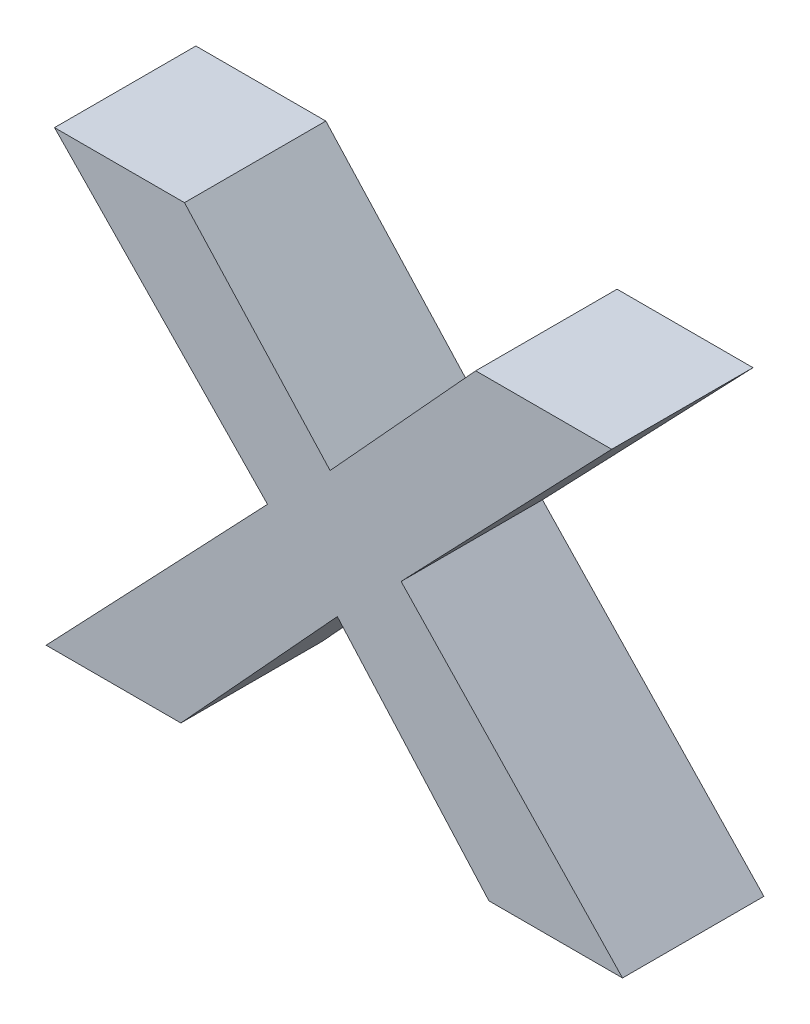
ISO-10303-21;
HEADER;
FILE_DESCRIPTION(('STEP AP214'),'2;1');
FILE_NAME('part.step','',(''),(''),'','','');
FILE_SCHEMA(('AUTOMOTIVE_DESIGN { 1 0 10303 214 1 1 1 1 }'));
ENDSEC;
DATA;
#1=APPLICATION_CONTEXT('core data for automotive mechanical design processes');
#2=APPLICATION_PROTOCOL_DEFINITION('international standard','automotive_design',2000,#1);
#3=PRODUCT_CONTEXT('',#1,'mechanical');
#4=PRODUCT('Part','Part','',(#3));
#5=PRODUCT_RELATED_PRODUCT_CATEGORY('part','',(#4));
#6=PRODUCT_DEFINITION_FORMATION('','',#4);
#7=PRODUCT_DEFINITION_CONTEXT('part definition',#1,'design');
#8=PRODUCT_DEFINITION('design','',#6,#7);
#9=PRODUCT_DEFINITION_SHAPE('','',#8);
#10=(LENGTH_UNIT() NAMED_UNIT(*) SI_UNIT(.MILLI.,.METRE.));
#11=(NAMED_UNIT(*) PLANE_ANGLE_UNIT() SI_UNIT($,.RADIAN.));
#12=(NAMED_UNIT(*) SI_UNIT($,.STERADIAN.) SOLID_ANGLE_UNIT());
#13=UNCERTAINTY_MEASURE_WITH_UNIT(LENGTH_MEASURE(1.E-05),#10,'distance_accuracy_value','');
#14=(GEOMETRIC_REPRESENTATION_CONTEXT(3) GLOBAL_UNCERTAINTY_ASSIGNED_CONTEXT((#13)) GLOBAL_UNIT_ASSIGNED_CONTEXT((#10,
#11,#12)) REPRESENTATION_CONTEXT('',''));
#15=CARTESIAN_POINT('',(0.,0.,0.));
#16=DIRECTION('',(0.,0.,1.));
#17=DIRECTION('',(1.,0.,0.));
#18=AXIS2_PLACEMENT_3D('',#15,#16,#17);
#19=CARTESIAN_POINT('',(-15.490338898199,-1.151083018456,-5.5));
#20=DIRECTION('',(0.,0.,1.));
#21=DIRECTION('',(0.,-1.,0.));
#22=AXIS2_PLACEMENT_3D('',#19,#20,#21);
#23=PLANE('',#22);
#24=DIRECTION('',(1.,0.,0.));
#25=VECTOR('',#24,1.);
#26=CARTESIAN_POINT('',(-17.525028602523,-2.747234350301,-5.5));
#27=LINE('',#26,#25);
#28=CARTESIAN_POINT('',(-17.525028602523,-2.747234350301,-5.5));
#29=VERTEX_POINT('',#28);
#30=CARTESIAN_POINT('',(-16.571944402523,-2.747234350301,-5.5));
#31=VERTEX_POINT('',#30);
#32=EDGE_CURVE('E187',#29,#31,#27,.T.);
#33=ORIENTED_EDGE('',*,*,#32,.T.);
#34=DIRECTION('',(0.676294852111834,0.736631029082425,0.));
#35=VECTOR('',#34,1.);
#36=CARTESIAN_POINT('',(-16.571944402523,-2.747234350301,-5.5));
#37=LINE('',#36,#35);
#38=CARTESIAN_POINT('',(-15.464955958079,-1.541485061412,-5.5));
#39=VERTEX_POINT('',#38);
#40=EDGE_CURVE('E175',#31,#39,#37,.T.);
#41=ORIENTED_EDGE('',*,*,#40,.T.);
#42=DIRECTION('',(0.664621174096527,-0.747180496896536,0.));
#43=VECTOR('',#42,1.);
#44=CARTESIAN_POINT('',(-15.464955958079,-1.541485061412,-5.5));
#45=LINE('',#44,#43);
#46=CARTESIAN_POINT('',(-14.392435313635,-2.747234350301,-5.5));
#47=VERTEX_POINT('',#46);
#48=EDGE_CURVE('E170',#39,#47,#45,.T.);
#49=ORIENTED_EDGE('',*,*,#48,.T.);
#50=DIRECTION('',(1.,0.,0.));
#51=VECTOR('',#50,1.);
#52=CARTESIAN_POINT('',(-14.392435313635,-2.747234350301,-5.5));
#53=LINE('',#52,#51);
#54=CARTESIAN_POINT('',(-13.447439602523,-2.747234350301,-5.5));
#55=VERTEX_POINT('',#54);
#56=EDGE_CURVE('E200',#47,#55,#53,.T.);
#57=ORIENTED_EDGE('',*,*,#56,.T.);
#58=DIRECTION('',(-0.689286496759423,0.724488871815932,0.));
#59=VECTOR('',#58,1.);
#60=CARTESIAN_POINT('',(-13.447439602523,-2.747234350301,-5.5));
#61=LINE('',#60,#59);
#62=CARTESIAN_POINT('',(-15.013868891412,-1.100806350301,-5.5));
#63=VERTEX_POINT('',#62);
#64=EDGE_CURVE('E148',#55,#63,#61,.T.);
#65=ORIENTED_EDGE('',*,*,#64,.T.);
#66=DIRECTION('',(0.691909548427936,0.721984194282845,0.));
#67=VECTOR('',#66,1.);
#68=CARTESIAN_POINT('',(-15.013868891412,-1.100806350301,-5.5));
#69=LINE('',#68,#67);
#70=CARTESIAN_POINT('',(-13.524198402523,0.453614383032,-5.5));
#71=VERTEX_POINT('',#70);
#72=EDGE_CURVE('E145',#63,#71,#69,.T.);
#73=ORIENTED_EDGE('',*,*,#72,.T.);
#74=DIRECTION('',(-1.,0.,0.));
#75=VECTOR('',#74,1.);
#76=CARTESIAN_POINT('',(-13.524198402523,0.453614383032,-5.5));
#77=LINE('',#76,#75);
#78=CARTESIAN_POINT('',(-14.486025846968,0.453614383032,-5.5));
#79=VERTEX_POINT('',#78);
#80=EDGE_CURVE('E131',#71,#79,#77,.T.);
#81=ORIENTED_EDGE('',*,*,#80,.T.);
#82=DIRECTION('',(-0.674961158054118,-0.737853261237113,0.));
#83=VECTOR('',#82,1.);
#84=CARTESIAN_POINT('',(-14.486025846968,0.453614383032,-5.5));
#85=LINE('',#84,#83);
#86=CARTESIAN_POINT('',(-15.516128491412,-0.67247203919,-5.5));
#87=VERTEX_POINT('',#86);
#88=EDGE_CURVE('E226',#79,#87,#85,.T.);
#89=ORIENTED_EDGE('',*,*,#88,.T.);
#90=DIRECTION('',(-0.674958137732798,0.737856024105159,0.));
#91=VECTOR('',#90,1.);
#92=CARTESIAN_POINT('',(-15.516128491412,-0.67247203919,-5.5));
#93=LINE('',#92,#91);
#94=CARTESIAN_POINT('',(-16.54622266919,0.453614383032,-5.5));
#95=VERTEX_POINT('',#94);
#96=EDGE_CURVE('E213',#87,#95,#93,.T.);
#97=ORIENTED_EDGE('',*,*,#96,.T.);
#98=DIRECTION('',(-1.,0.,0.));
#99=VECTOR('',#98,1.);
#100=CARTESIAN_POINT('',(-16.54622266919,0.453614383032,-5.5));
#101=LINE('',#100,#99);
#102=CARTESIAN_POINT('',(-17.465643402523,0.453614383032,-5.5));
#103=VERTEX_POINT('',#102);
#104=EDGE_CURVE('E216',#95,#103,#101,.T.);
#105=ORIENTED_EDGE('',*,*,#104,.T.);
#106=DIRECTION('',(0.696017007431194,-0.718025295770647,0.));
#107=VECTOR('',#106,1.);
#108=CARTESIAN_POINT('',(-17.465643402523,0.453614383032,-5.5));
#109=LINE('',#108,#107);
#110=CARTESIAN_POINT('',(-15.958867424746,-1.100806350301,-5.5));
#111=VERTEX_POINT('',#110);
#112=EDGE_CURVE('E196',#103,#111,#109,.T.);
#113=ORIENTED_EDGE('',*,*,#112,.T.);
#114=DIRECTION('',(-0.689224564032195,-0.724547790235145,0.));
#115=VECTOR('',#114,1.);
#116=CARTESIAN_POINT('',(-15.958867424746,-1.100806350301,-5.5));
#117=LINE('',#116,#115);
#118=EDGE_CURVE('E11',#111,#29,#117,.T.);
#119=ORIENTED_EDGE('',*,*,#118,.T.);
#120=EDGE_LOOP('',(#33,#41,#49,#57,#65,#73,#81,#89,#97,#105,#113,#119));
#121=FACE_BOUND('',#120,.T.);
#122=ADVANCED_FACE('F16',(#121),#23,.T.);
#123=CARTESIAN_POINT('',(-15.490338898199,-1.151083018456,-6.5));
#124=DIRECTION('',(0.,0.,1.));
#125=DIRECTION('',(0.,-1.,0.));
#126=AXIS2_PLACEMENT_3D('',#123,#124,#125);
#127=PLANE('',#126);
#128=DIRECTION('',(1.,0.,0.));
#129=VECTOR('',#128,1.);
#130=CARTESIAN_POINT('',(-17.525028602523,-2.747234350301,-6.5));
#131=LINE('',#130,#129);
#132=CARTESIAN_POINT('',(-17.525028602523,-2.747234350301,-6.5));
#133=VERTEX_POINT('',#132);
#134=CARTESIAN_POINT('',(-16.571944402523,-2.747234350301,-6.5));
#135=VERTEX_POINT('',#134);
#136=EDGE_CURVE('E245',#133,#135,#131,.T.);
#137=ORIENTED_EDGE('',*,*,#136,.F.);
#138=DIRECTION('',(-0.689224564032195,-0.724547790235145,0.));
#139=VECTOR('',#138,1.);
#140=CARTESIAN_POINT('',(-15.958867424746,-1.100806350301,-6.5));
#141=LINE('',#140,#139);
#142=CARTESIAN_POINT('',(-15.958867424746,-1.100806350301,-6.5));
#143=VERTEX_POINT('',#142);
#144=EDGE_CURVE('E27',#143,#133,#141,.T.);
#145=ORIENTED_EDGE('',*,*,#144,.F.);
#146=DIRECTION('',(0.696017007431194,-0.718025295770647,0.));
#147=VECTOR('',#146,1.);
#148=CARTESIAN_POINT('',(-17.465643402523,0.453614383032,-6.5));
#149=LINE('',#148,#147);
#150=CARTESIAN_POINT('',(-17.465643402523,0.453614383032,-6.5));
#151=VERTEX_POINT('',#150);
#152=EDGE_CURVE('E220',#151,#143,#149,.T.);
#153=ORIENTED_EDGE('',*,*,#152,.F.);
#154=DIRECTION('',(-1.,0.,0.));
#155=VECTOR('',#154,1.);
#156=CARTESIAN_POINT('',(-16.54622266919,0.453614383032,-6.5));
#157=LINE('',#156,#155);
#158=CARTESIAN_POINT('',(-16.54622266919,0.453614383032,-6.5));
#159=VERTEX_POINT('',#158);
#160=EDGE_CURVE('E208',#159,#151,#157,.T.);
#161=ORIENTED_EDGE('',*,*,#160,.F.);
#162=DIRECTION('',(-0.674958137732798,0.737856024105159,0.));
#163=VECTOR('',#162,1.);
#164=CARTESIAN_POINT('',(-15.516128491412,-0.67247203919,-6.5));
#165=LINE('',#164,#163);
#166=CARTESIAN_POINT('',(-15.516128491412,-0.67247203919,-6.5));
#167=VERTEX_POINT('',#166);
#168=EDGE_CURVE('E221',#167,#159,#165,.T.);
#169=ORIENTED_EDGE('',*,*,#168,.F.);
#170=DIRECTION('',(-0.674961158054118,-0.737853261237113,0.));
#171=VECTOR('',#170,1.);
#172=CARTESIAN_POINT('',(-14.486025846968,0.453614383032,-6.5));
#173=LINE('',#172,#171);
#174=CARTESIAN_POINT('',(-14.486025846968,0.453614383032,-6.5));
#175=VERTEX_POINT('',#174);
#176=EDGE_CURVE('E142',#175,#167,#173,.T.);
#177=ORIENTED_EDGE('',*,*,#176,.F.);
#178=DIRECTION('',(-1.,0.,0.));
#179=VECTOR('',#178,1.);
#180=CARTESIAN_POINT('',(-13.524198402523,0.453614383032,-6.5));
#181=LINE('',#180,#179);
#182=CARTESIAN_POINT('',(-13.524198402523,0.453614383032,-6.5));
#183=VERTEX_POINT('',#182);
#184=EDGE_CURVE('E153',#183,#175,#181,.T.);
#185=ORIENTED_EDGE('',*,*,#184,.F.);
#186=DIRECTION('',(0.691909548427936,0.721984194282845,0.));
#187=VECTOR('',#186,1.);
#188=CARTESIAN_POINT('',(-15.013868891412,-1.100806350301,-6.5));
#189=LINE('',#188,#187);
#190=CARTESIAN_POINT('',(-15.013868891412,-1.100806350301,-6.5));
#191=VERTEX_POINT('',#190);
#192=EDGE_CURVE('E156',#191,#183,#189,.T.);
#193=ORIENTED_EDGE('',*,*,#192,.F.);
#194=DIRECTION('',(-0.689286496759423,0.724488871815932,0.));
#195=VECTOR('',#194,1.);
#196=CARTESIAN_POINT('',(-13.447439602523,-2.747234350301,-6.5));
#197=LINE('',#196,#195);
#198=CARTESIAN_POINT('',(-13.447439602523,-2.747234350301,-6.5));
#199=VERTEX_POINT('',#198);
#200=EDGE_CURVE('E203',#199,#191,#197,.T.);
#201=ORIENTED_EDGE('',*,*,#200,.F.);
#202=DIRECTION('',(1.,0.,0.));
#203=VECTOR('',#202,1.);
#204=CARTESIAN_POINT('',(-14.392435313635,-2.747234350301,-6.5));
#205=LINE('',#204,#203);
#206=CARTESIAN_POINT('',(-14.392435313635,-2.747234350301,-6.5));
#207=VERTEX_POINT('',#206);
#208=EDGE_CURVE('E166',#207,#199,#205,.T.);
#209=ORIENTED_EDGE('',*,*,#208,.F.);
#210=DIRECTION('',(0.664621174096527,-0.747180496896536,0.));
#211=VECTOR('',#210,1.);
#212=CARTESIAN_POINT('',(-15.464955958079,-1.541485061412,-6.5));
#213=LINE('',#212,#211);
#214=CARTESIAN_POINT('',(-15.464955958079,-1.541485061412,-6.5));
#215=VERTEX_POINT('',#214);
#216=EDGE_CURVE('E171',#215,#207,#213,.T.);
#217=ORIENTED_EDGE('',*,*,#216,.F.);
#218=DIRECTION('',(0.676294852111834,0.736631029082425,0.));
#219=VECTOR('',#218,1.);
#220=CARTESIAN_POINT('',(-16.571944402523,-2.747234350301,-6.5));
#221=LINE('',#220,#219);
#222=EDGE_CURVE('E176',#135,#215,#221,.T.);
#223=ORIENTED_EDGE('',*,*,#222,.F.);
#224=EDGE_LOOP('',(#137,#145,#153,#161,#169,#177,#185,#193,#201,#209,#217,#223));
#225=FACE_BOUND('',#224,.T.);
#226=ADVANCED_FACE('F276',(#225),#127,.F.);
#227=CARTESIAN_POINT('',(-16.7419480136345,-1.924020350301,-5.49));
#228=DIRECTION('',(0.724547790235145,-0.689224564032195,0.));
#229=DIRECTION('',(0.689224564032195,0.724547790235145,0.));
#230=AXIS2_PLACEMENT_3D('',#227,#228,#229);
#231=PLANE('',#230);
#232=DIRECTION('',(0.,0.,1.));
#233=VECTOR('',#232,1.);
#234=CARTESIAN_POINT('',(-15.958867424746,-1.100806350301,-6.5));
#235=LINE('',#234,#233);
#236=EDGE_CURVE('E198',#143,#111,#235,.T.);
#237=ORIENTED_EDGE('',*,*,#236,.F.);
#238=ORIENTED_EDGE('',*,*,#144,.T.);
#239=DIRECTION('',(0.,0.,1.));
#240=VECTOR('',#239,1.);
#241=CARTESIAN_POINT('',(-17.525028602523,-2.747234350301,-6.5));
#242=LINE('',#241,#240);
#243=EDGE_CURVE('E242',#133,#29,#242,.T.);
#244=ORIENTED_EDGE('',*,*,#243,.T.);
#245=ORIENTED_EDGE('',*,*,#118,.F.);
#246=EDGE_LOOP('',(#237,#238,#244,#245));
#247=FACE_BOUND('',#246,.T.);
#248=ADVANCED_FACE('F284',(#247),#231,.F.);
#249=CARTESIAN_POINT('',(-16.7122554136345,-0.3235959836345,-5.49));
#250=DIRECTION('',(0.718025295770647,0.696017007431194,0.));
#251=DIRECTION('',(0.,0.,-1.));
#252=AXIS2_PLACEMENT_3D('',#249,#250,#251);
#253=PLANE('',#252);
#254=DIRECTION('',(0.,0.,1.));
#255=VECTOR('',#254,1.);
#256=CARTESIAN_POINT('',(-17.465643402523,0.453614383032,-6.5));
#257=LINE('',#256,#255);
#258=EDGE_CURVE('E212',#151,#103,#257,.T.);
#259=ORIENTED_EDGE('',*,*,#258,.F.);
#260=ORIENTED_EDGE('',*,*,#152,.T.);
#261=ORIENTED_EDGE('',*,*,#236,.T.);
#262=ORIENTED_EDGE('',*,*,#112,.F.);
#263=EDGE_LOOP('',(#259,#260,#261,#262));
#264=FACE_BOUND('',#263,.T.);
#265=ADVANCED_FACE('F279',(#264),#253,.F.);
#266=CARTESIAN_POINT('',(-17.0059330358565,0.453614383032,-5.49));
#267=DIRECTION('',(0.,-1.,0.));
#268=DIRECTION('',(0.,0.,1.));
#269=AXIS2_PLACEMENT_3D('',#266,#267,#268);
#270=PLANE('',#269);
#271=DIRECTION('',(0.,0.,1.));
#272=VECTOR('',#271,1.);
#273=CARTESIAN_POINT('',(-16.54622266919,0.453614383032,-6.5));
#274=LINE('',#273,#272);
#275=EDGE_CURVE('E225',#159,#95,#274,.T.);
#276=ORIENTED_EDGE('',*,*,#275,.F.);
#277=ORIENTED_EDGE('',*,*,#160,.T.);
#278=ORIENTED_EDGE('',*,*,#258,.T.);
#279=ORIENTED_EDGE('',*,*,#104,.F.);
#280=EDGE_LOOP('',(#276,#277,#278,#279));
#281=FACE_BOUND('',#280,.T.);
#282=ADVANCED_FACE('F268',(#281),#270,.F.);
#283=CARTESIAN_POINT('',(-16.031175580301,-0.109428828079,-5.49));
#284=DIRECTION('',(-0.73785602410516,-0.674958137732797,0.));
#285=DIRECTION('',(0.,0.,1.));
#286=AXIS2_PLACEMENT_3D('',#283,#284,#285);
#287=PLANE('',#286);
#288=DIRECTION('',(0.,0.,1.));
#289=VECTOR('',#288,1.);
#290=CARTESIAN_POINT('',(-15.516128491412,-0.67247203919,-6.5));
#291=LINE('',#290,#289);
#292=EDGE_CURVE('E238',#167,#87,#291,.T.);
#293=ORIENTED_EDGE('',*,*,#292,.F.);
#294=ORIENTED_EDGE('',*,*,#168,.T.);
#295=ORIENTED_EDGE('',*,*,#275,.T.);
#296=ORIENTED_EDGE('',*,*,#96,.F.);
#297=EDGE_LOOP('',(#293,#294,#295,#296));
#298=FACE_BOUND('',#297,.T.);
#299=ADVANCED_FACE('F266',(#298),#287,.F.);
#300=CARTESIAN_POINT('',(-15.00107716919,-0.109428828079,-5.49));
#301=DIRECTION('',(0.737853261237113,-0.674961158054118,0.));
#302=DIRECTION('',(0.674961158054118,0.737853261237113,0.));
#303=AXIS2_PLACEMENT_3D('',#300,#301,#302);
#304=PLANE('',#303);
#305=DIRECTION('',(0.,0.,1.));
#306=VECTOR('',#305,1.);
#307=CARTESIAN_POINT('',(-14.486025846968,0.453614383032,-6.5));
#308=LINE('',#307,#306);
#309=EDGE_CURVE('E20',#175,#79,#308,.T.);
#310=ORIENTED_EDGE('',*,*,#309,.F.);
#311=ORIENTED_EDGE('',*,*,#176,.T.);
#312=ORIENTED_EDGE('',*,*,#292,.T.);
#313=ORIENTED_EDGE('',*,*,#88,.F.);
#314=EDGE_LOOP('',(#310,#311,#312,#313));
#315=FACE_BOUND('',#314,.T.);
#316=ADVANCED_FACE('F273',(#315),#304,.F.);
#317=CARTESIAN_POINT('',(-14.0051121247455,0.453614383032,-5.49));
#318=DIRECTION('',(0.,-1.,0.));
#319=DIRECTION('',(0.,0.,1.));
#320=AXIS2_PLACEMENT_3D('',#317,#318,#319);
#321=PLANE('',#320);
#322=DIRECTION('',(0.,0.,1.));
#323=VECTOR('',#322,1.);
#324=CARTESIAN_POINT('',(-13.524198402523,0.453614383032,-6.5));
#325=LINE('',#324,#323);
#326=EDGE_CURVE('E136',#183,#71,#325,.T.);
#327=ORIENTED_EDGE('',*,*,#326,.F.);
#328=ORIENTED_EDGE('',*,*,#184,.T.);
#329=ORIENTED_EDGE('',*,*,#309,.T.);
#330=ORIENTED_EDGE('',*,*,#80,.F.);
#331=EDGE_LOOP('',(#327,#328,#329,#330));
#332=FACE_BOUND('',#331,.T.);
#333=ADVANCED_FACE('F133',(#332),#321,.F.);
#334=CARTESIAN_POINT('',(-14.2690336469675,-0.3235959836345,-5.49));
#335=DIRECTION('',(-0.721984194282846,0.691909548427936,0.));
#336=DIRECTION('',(0.,0.,1.));
#337=AXIS2_PLACEMENT_3D('',#334,#335,#336);
#338=PLANE('',#337);
#339=DIRECTION('',(0.,0.,1.));
#340=VECTOR('',#339,1.);
#341=CARTESIAN_POINT('',(-15.013868891412,-1.100806350301,-6.5));
#342=LINE('',#341,#340);
#343=EDGE_CURVE('E206',#191,#63,#342,.T.);
#344=ORIENTED_EDGE('',*,*,#343,.F.);
#345=ORIENTED_EDGE('',*,*,#192,.T.);
#346=ORIENTED_EDGE('',*,*,#326,.T.);
#347=ORIENTED_EDGE('',*,*,#72,.F.);
#348=EDGE_LOOP('',(#344,#345,#346,#347));
#349=FACE_BOUND('',#348,.T.);
#350=ADVANCED_FACE('F155',(#349),#338,.F.);
#351=CARTESIAN_POINT('',(-14.2306542469675,-1.924020350301,-5.49));
#352=DIRECTION('',(-0.724488871815931,-0.689286496759424,0.));
#353=DIRECTION('',(0.,0.,1.));
#354=AXIS2_PLACEMENT_3D('',#351,#352,#353);
#355=PLANE('',#354);
#356=DIRECTION('',(0.,0.,1.));
#357=VECTOR('',#356,1.);
#358=CARTESIAN_POINT('',(-13.447439602523,-2.747234350301,-6.5));
#359=LINE('',#358,#357);
#360=EDGE_CURVE('E204',#199,#55,#359,.T.);
#361=ORIENTED_EDGE('',*,*,#360,.F.);
#362=ORIENTED_EDGE('',*,*,#200,.T.);
#363=ORIENTED_EDGE('',*,*,#343,.T.);
#364=ORIENTED_EDGE('',*,*,#64,.F.);
#365=EDGE_LOOP('',(#361,#362,#363,#364));
#366=FACE_BOUND('',#365,.T.);
#367=ADVANCED_FACE('F297',(#366),#355,.F.);
#368=CARTESIAN_POINT('',(-13.919937458079,-2.747234350301,-5.49));
#369=DIRECTION('',(0.,1.,0.));
#370=DIRECTION('',(-1.,0.,0.));
#371=AXIS2_PLACEMENT_3D('',#368,#369,#370);
#372=PLANE('',#371);
#373=DIRECTION('',(0.,0.,1.));
#374=VECTOR('',#373,1.);
#375=CARTESIAN_POINT('',(-14.392435313635,-2.747234350301,-6.5));
#376=LINE('',#375,#374);
#377=EDGE_CURVE('E168',#207,#47,#376,.T.);
#378=ORIENTED_EDGE('',*,*,#377,.F.);
#379=ORIENTED_EDGE('',*,*,#208,.T.);
#380=ORIENTED_EDGE('',*,*,#360,.T.);
#381=ORIENTED_EDGE('',*,*,#56,.F.);
#382=EDGE_LOOP('',(#378,#379,#380,#381));
#383=FACE_BOUND('',#382,.T.);
#384=ADVANCED_FACE('F18',(#383),#372,.F.);
#385=CARTESIAN_POINT('',(-14.928695635857,-2.1443597058565,-5.49));
#386=DIRECTION('',(0.747180496896536,0.664621174096527,0.));
#387=DIRECTION('',(0.,0.,-1.));
#388=AXIS2_PLACEMENT_3D('',#385,#386,#387);
#389=PLANE('',#388);
#390=DIRECTION('',(0.,0.,1.));
#391=VECTOR('',#390,1.);
#392=CARTESIAN_POINT('',(-15.464955958079,-1.541485061412,-6.5));
#393=LINE('',#392,#391);
#394=EDGE_CURVE('E172',#215,#39,#393,.T.);
#395=ORIENTED_EDGE('',*,*,#394,.F.);
#396=ORIENTED_EDGE('',*,*,#216,.T.);
#397=ORIENTED_EDGE('',*,*,#377,.T.);
#398=ORIENTED_EDGE('',*,*,#48,.F.);
#399=EDGE_LOOP('',(#395,#396,#397,#398));
#400=FACE_BOUND('',#399,.T.);
#401=ADVANCED_FACE('F292',(#400),#389,.F.);
#402=CARTESIAN_POINT('',(-16.018450180301,-2.1443597058565,-5.49));
#403=DIRECTION('',(-0.736631029082425,0.676294852111834,0.));
#404=DIRECTION('',(0.,0.,1.));
#405=AXIS2_PLACEMENT_3D('',#402,#403,#404);
#406=PLANE('',#405);
#407=DIRECTION('',(0.,0.,1.));
#408=VECTOR('',#407,1.);
#409=CARTESIAN_POINT('',(-16.571944402523,-2.747234350301,-6.5));
#410=LINE('',#409,#408);
#411=EDGE_CURVE('E192',#135,#31,#410,.T.);
#412=ORIENTED_EDGE('',*,*,#411,.F.);
#413=ORIENTED_EDGE('',*,*,#222,.T.);
#414=ORIENTED_EDGE('',*,*,#394,.T.);
#415=ORIENTED_EDGE('',*,*,#40,.F.);
#416=EDGE_LOOP('',(#412,#413,#414,#415));
#417=FACE_BOUND('',#416,.T.);
#418=ADVANCED_FACE('F286',(#417),#406,.F.);
#419=CARTESIAN_POINT('',(-17.048486502523,-2.747234350301,-5.49));
#420=DIRECTION('',(0.,1.,0.));
#421=DIRECTION('',(-1.,0.,0.));
#422=AXIS2_PLACEMENT_3D('',#419,#420,#421);
#423=PLANE('',#422);
#424=ORIENTED_EDGE('',*,*,#243,.F.);
#425=ORIENTED_EDGE('',*,*,#136,.T.);
#426=ORIENTED_EDGE('',*,*,#411,.T.);
#427=ORIENTED_EDGE('',*,*,#32,.F.);
#428=EDGE_LOOP('',(#424,#425,#426,#427));
#429=FACE_BOUND('',#428,.T.);
#430=ADVANCED_FACE('F283',(#429),#423,.F.);
#431=CLOSED_SHELL('',(#122,#226,#248,#265,#282,#299,#316,#333,#350,#367,#384,#401,#418,#430));
#432=MANIFOLD_SOLID_BREP('B1',#431);
#433=ADVANCED_BREP_SHAPE_REPRESENTATION('',(#18,#432),#14);
#434=SHAPE_DEFINITION_REPRESENTATION(#9,#433);
ENDSEC;
END-ISO-10303-21;
